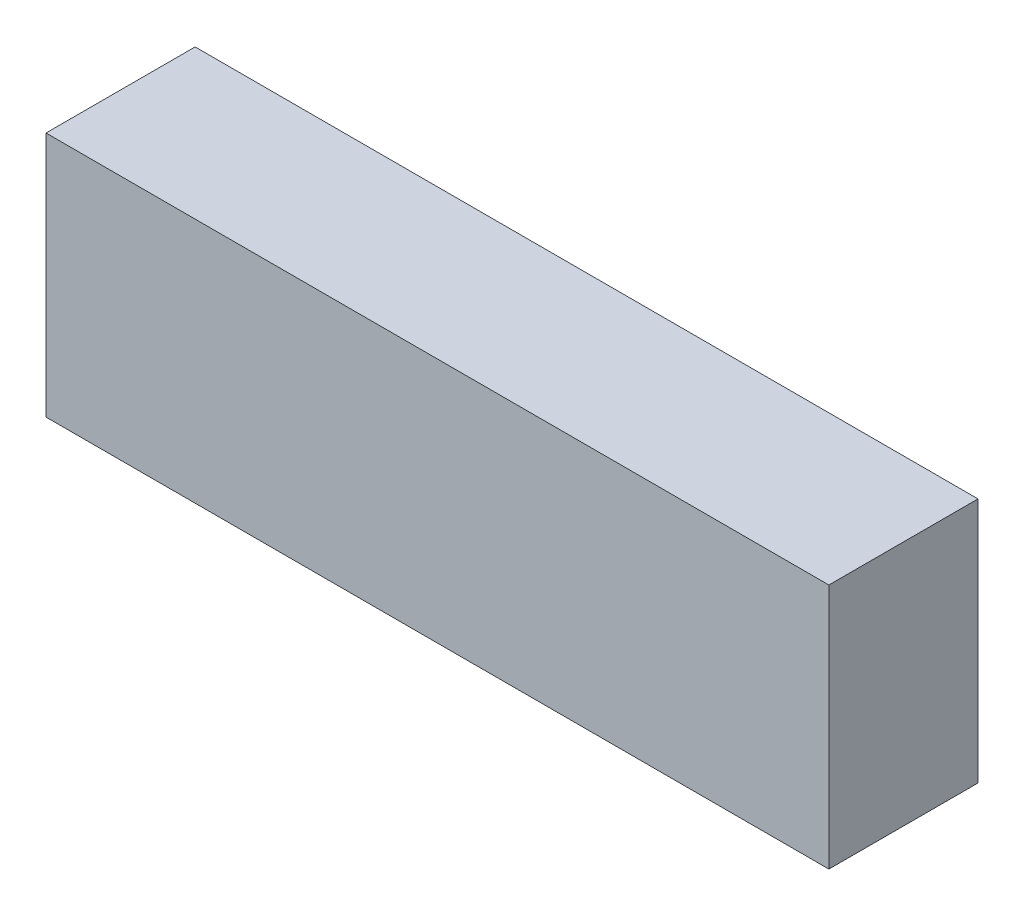
ISO-10303-21;
HEADER;
FILE_DESCRIPTION(('STEP AP214'),'2;1');
FILE_NAME('part.step','',(''),(''),'','','');
FILE_SCHEMA(('AUTOMOTIVE_DESIGN { 1 0 10303 214 1 1 1 1 }'));
ENDSEC;
DATA;
#1=APPLICATION_CONTEXT('core data for automotive mechanical design processes');
#2=APPLICATION_PROTOCOL_DEFINITION('international standard','automotive_design',2000,#1);
#3=PRODUCT_CONTEXT('',#1,'mechanical');
#4=PRODUCT('Part','Part','',(#3));
#5=PRODUCT_RELATED_PRODUCT_CATEGORY('part','',(#4));
#6=PRODUCT_DEFINITION_FORMATION('','',#4);
#7=PRODUCT_DEFINITION_CONTEXT('part definition',#1,'design');
#8=PRODUCT_DEFINITION('design','',#6,#7);
#9=PRODUCT_DEFINITION_SHAPE('','',#8);
#10=(LENGTH_UNIT() NAMED_UNIT(*) SI_UNIT(.MILLI.,.METRE.));
#11=(NAMED_UNIT(*) PLANE_ANGLE_UNIT() SI_UNIT($,.RADIAN.));
#12=(NAMED_UNIT(*) SI_UNIT($,.STERADIAN.) SOLID_ANGLE_UNIT());
#13=UNCERTAINTY_MEASURE_WITH_UNIT(LENGTH_MEASURE(1.E-05),#10,'distance_accuracy_value','');
#14=(GEOMETRIC_REPRESENTATION_CONTEXT(3) GLOBAL_UNCERTAINTY_ASSIGNED_CONTEXT((#13)) GLOBAL_UNIT_ASSIGNED_CONTEXT((#10,
#11,#12)) REPRESENTATION_CONTEXT('',''));
#15=CARTESIAN_POINT('',(0.,0.,0.));
#16=DIRECTION('',(0.,0.,1.));
#17=DIRECTION('',(1.,0.,0.));
#18=AXIS2_PLACEMENT_3D('',#15,#16,#17);
#19=CARTESIAN_POINT('',(-44.2204899777283,5.71269487750557,20.));
#20=DIRECTION('',(1.,0.,0.));
#21=DIRECTION('',(0.,1.,0.));
#22=AXIS2_PLACEMENT_3D('',#19,#20,#21);
#23=PLANE('',#22);
#24=DIRECTION('',(0.,-1.,0.));
#25=VECTOR('',#24,1.);
#26=CARTESIAN_POINT('',(-44.2204899777283,5.71269487750557,0.));
#27=LINE('',#26,#25);
#28=CARTESIAN_POINT('',(-44.2204899777283,5.71269487750557,0.));
#29=VERTEX_POINT('',#28);
#30=CARTESIAN_POINT('',(-44.2204899777283,-27.2873051224944,0.));
#31=VERTEX_POINT('',#30);
#32=EDGE_CURVE('E108',#29,#31,#27,.T.);
#33=ORIENTED_EDGE('',*,*,#32,.T.);
#34=DIRECTION('',(0.,0.,-1.));
#35=VECTOR('',#34,1.);
#36=CARTESIAN_POINT('',(-44.2204899777283,-27.2873051224944,20.));
#37=LINE('',#36,#35);
#38=CARTESIAN_POINT('',(-44.2204899777283,-27.2873051224944,20.));
#39=VERTEX_POINT('',#38);
#40=EDGE_CURVE('E11',#39,#31,#37,.T.);
#41=ORIENTED_EDGE('',*,*,#40,.F.);
#42=DIRECTION('',(0.,-1.,0.));
#43=VECTOR('',#42,1.);
#44=CARTESIAN_POINT('',(-44.2204899777283,5.71269487750557,20.));
#45=LINE('',#44,#43);
#46=CARTESIAN_POINT('',(-44.2204899777283,5.71269487750557,20.));
#47=VERTEX_POINT('',#46);
#48=EDGE_CURVE('E96',#47,#39,#45,.T.);
#49=ORIENTED_EDGE('',*,*,#48,.F.);
#50=DIRECTION('',(0.,0.,-1.));
#51=VECTOR('',#50,1.);
#52=CARTESIAN_POINT('',(-44.2204899777283,5.71269487750557,20.));
#53=LINE('',#52,#51);
#54=EDGE_CURVE('E104',#47,#29,#53,.T.);
#55=ORIENTED_EDGE('',*,*,#54,.T.);
#56=EDGE_LOOP('',(#33,#41,#49,#55));
#57=FACE_BOUND('',#56,.T.);
#58=ADVANCED_FACE('F45',(#57),#23,.F.);
#59=CARTESIAN_POINT('',(-44.2204899777283,-27.2873051224944,20.));
#60=DIRECTION('',(0.,1.,0.));
#61=DIRECTION('',(0.,0.,1.));
#62=AXIS2_PLACEMENT_3D('',#59,#60,#61);
#63=PLANE('',#62);
#64=DIRECTION('',(1.,0.,0.));
#65=VECTOR('',#64,1.);
#66=CARTESIAN_POINT('',(-44.2204899777283,-27.2873051224944,0.));
#67=LINE('',#66,#65);
#68=CARTESIAN_POINT('',(60.7795100222717,-27.2873051224944,0.));
#69=VERTEX_POINT('',#68);
#70=EDGE_CURVE('E100',#31,#69,#67,.T.);
#71=ORIENTED_EDGE('',*,*,#70,.T.);
#72=DIRECTION('',(0.,0.,-1.));
#73=VECTOR('',#72,1.);
#74=CARTESIAN_POINT('',(60.7795100222717,-27.2873051224944,20.));
#75=LINE('',#74,#73);
#76=CARTESIAN_POINT('',(60.7795100222717,-27.2873051224944,20.));
#77=VERTEX_POINT('',#76);
#78=EDGE_CURVE('E53',#77,#69,#75,.T.);
#79=ORIENTED_EDGE('',*,*,#78,.F.);
#80=DIRECTION('',(1.,0.,0.));
#81=VECTOR('',#80,1.);
#82=CARTESIAN_POINT('',(-44.2204899777283,-27.2873051224944,20.));
#83=LINE('',#82,#81);
#84=EDGE_CURVE('E91',#39,#77,#83,.T.);
#85=ORIENTED_EDGE('',*,*,#84,.F.);
#86=ORIENTED_EDGE('',*,*,#40,.T.);
#87=EDGE_LOOP('',(#71,#79,#85,#86));
#88=FACE_BOUND('',#87,.T.);
#89=ADVANCED_FACE('F99',(#88),#63,.F.);
#90=CARTESIAN_POINT('',(60.7795100222717,5.71269487750557,20.));
#91=DIRECTION('',(-1.,0.,0.));
#92=DIRECTION('',(0.,-1.,0.));
#93=AXIS2_PLACEMENT_3D('',#90,#91,#92);
#94=PLANE('',#93);
#95=DIRECTION('',(0.,1.,0.));
#96=VECTOR('',#95,1.);
#97=CARTESIAN_POINT('',(60.7795100222717,5.71269487750557,0.));
#98=LINE('',#97,#96);
#99=CARTESIAN_POINT('',(60.7795100222717,5.71269487750557,0.));
#100=VERTEX_POINT('',#99);
#101=EDGE_CURVE('E78',#69,#100,#98,.T.);
#102=ORIENTED_EDGE('',*,*,#101,.T.);
#103=DIRECTION('',(0.,0.,-1.));
#104=VECTOR('',#103,1.);
#105=CARTESIAN_POINT('',(60.7795100222717,5.71269487750557,20.));
#106=LINE('',#105,#104);
#107=CARTESIAN_POINT('',(60.7795100222717,5.71269487750557,20.));
#108=VERTEX_POINT('',#107);
#109=EDGE_CURVE('E101',#108,#100,#106,.T.);
#110=ORIENTED_EDGE('',*,*,#109,.F.);
#111=DIRECTION('',(0.,1.,0.));
#112=VECTOR('',#111,1.);
#113=CARTESIAN_POINT('',(60.7795100222717,5.71269487750557,20.));
#114=LINE('',#113,#112);
#115=EDGE_CURVE('E94',#77,#108,#114,.T.);
#116=ORIENTED_EDGE('',*,*,#115,.F.);
#117=ORIENTED_EDGE('',*,*,#78,.T.);
#118=EDGE_LOOP('',(#102,#110,#116,#117));
#119=FACE_BOUND('',#118,.T.);
#120=ADVANCED_FACE('F102',(#119),#94,.F.);
#121=CARTESIAN_POINT('',(-44.2204899777283,5.71269487750557,20.));
#122=DIRECTION('',(0.,-1.,0.));
#123=DIRECTION('',(0.,0.,-1.));
#124=AXIS2_PLACEMENT_3D('',#121,#122,#123);
#125=PLANE('',#124);
#126=DIRECTION('',(-1.,0.,0.));
#127=VECTOR('',#126,1.);
#128=CARTESIAN_POINT('',(-44.2204899777283,5.71269487750557,0.));
#129=LINE('',#128,#127);
#130=EDGE_CURVE('E84',#100,#29,#129,.T.);
#131=ORIENTED_EDGE('',*,*,#130,.T.);
#132=ORIENTED_EDGE('',*,*,#54,.F.);
#133=DIRECTION('',(-1.,0.,0.));
#134=VECTOR('',#133,1.);
#135=CARTESIAN_POINT('',(-44.2204899777283,5.71269487750557,20.));
#136=LINE('',#135,#134);
#137=EDGE_CURVE('E61',#108,#47,#136,.T.);
#138=ORIENTED_EDGE('',*,*,#137,.F.);
#139=ORIENTED_EDGE('',*,*,#109,.T.);
#140=EDGE_LOOP('',(#131,#132,#138,#139));
#141=FACE_BOUND('',#140,.T.);
#142=ADVANCED_FACE('F115',(#141),#125,.F.);
#143=CARTESIAN_POINT('',(0.,0.,20.));
#144=DIRECTION('',(0.,0.,1.));
#145=DIRECTION('',(1.,0.,0.));
#146=AXIS2_PLACEMENT_3D('',#143,#144,#145);
#147=PLANE('',#146);
#148=ORIENTED_EDGE('',*,*,#48,.T.);
#149=ORIENTED_EDGE('',*,*,#84,.T.);
#150=ORIENTED_EDGE('',*,*,#115,.T.);
#151=ORIENTED_EDGE('',*,*,#137,.T.);
#152=EDGE_LOOP('',(#148,#149,#150,#151));
#153=FACE_BOUND('',#152,.T.);
#154=ADVANCED_FACE('F92',(#153),#147,.T.);
#155=CARTESIAN_POINT('',(0.,0.,0.));
#156=DIRECTION('',(0.,0.,1.));
#157=DIRECTION('',(1.,0.,0.));
#158=AXIS2_PLACEMENT_3D('',#155,#156,#157);
#159=PLANE('',#158);
#160=ORIENTED_EDGE('',*,*,#32,.F.);
#161=ORIENTED_EDGE('',*,*,#130,.F.);
#162=ORIENTED_EDGE('',*,*,#101,.F.);
#163=ORIENTED_EDGE('',*,*,#70,.F.);
#164=EDGE_LOOP('',(#160,#161,#162,#163));
#165=FACE_BOUND('',#164,.T.);
#166=ADVANCED_FACE('F118',(#165),#159,.F.);
#167=CLOSED_SHELL('',(#58,#89,#120,#142,#154,#166));
#168=MANIFOLD_SOLID_BREP('B2',#167);
#169=ADVANCED_BREP_SHAPE_REPRESENTATION('',(#18,#168),#14);
#170=SHAPE_DEFINITION_REPRESENTATION(#9,#169);
ENDSEC;
END-ISO-10303-21;
